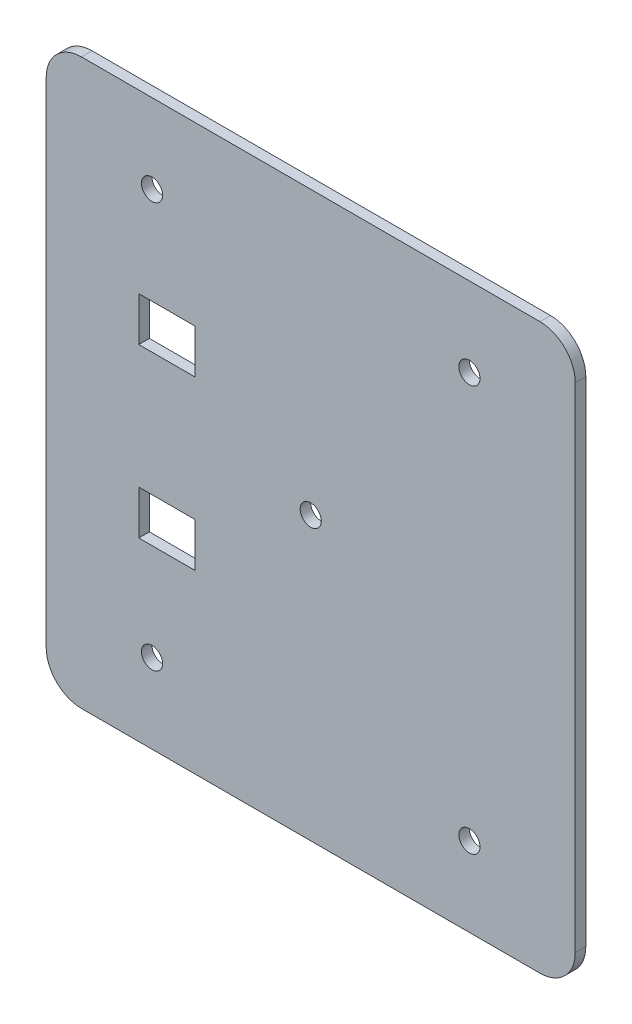
ISO-10303-21;
HEADER;
FILE_DESCRIPTION(('STEP AP214'),'2;1');
FILE_NAME('part.step','',(''),(''),'','','');
FILE_SCHEMA(('AUTOMOTIVE_DESIGN { 1 0 10303 214 1 1 1 1 }'));
ENDSEC;
DATA;
#1=APPLICATION_CONTEXT('core data for automotive mechanical design processes');
#2=APPLICATION_PROTOCOL_DEFINITION('international standard','automotive_design',2000,#1);
#3=PRODUCT_CONTEXT('',#1,'mechanical');
#4=PRODUCT('Part','Part','',(#3));
#5=PRODUCT_RELATED_PRODUCT_CATEGORY('part','',(#4));
#6=PRODUCT_DEFINITION_FORMATION('','',#4);
#7=PRODUCT_DEFINITION_CONTEXT('part definition',#1,'design');
#8=PRODUCT_DEFINITION('design','',#6,#7);
#9=PRODUCT_DEFINITION_SHAPE('','',#8);
#10=(LENGTH_UNIT() NAMED_UNIT(*) SI_UNIT(.MILLI.,.METRE.));
#11=(NAMED_UNIT(*) PLANE_ANGLE_UNIT() SI_UNIT($,.RADIAN.));
#12=(NAMED_UNIT(*) SI_UNIT($,.STERADIAN.) SOLID_ANGLE_UNIT());
#13=UNCERTAINTY_MEASURE_WITH_UNIT(LENGTH_MEASURE(1.E-05),#10,'distance_accuracy_value','');
#14=(GEOMETRIC_REPRESENTATION_CONTEXT(3) GLOBAL_UNCERTAINTY_ASSIGNED_CONTEXT((#13)) GLOBAL_UNIT_ASSIGNED_CONTEXT((#10,
#11,#12)) REPRESENTATION_CONTEXT('',''));
#15=CARTESIAN_POINT('',(0.,0.,0.));
#16=DIRECTION('',(0.,0.,1.));
#17=DIRECTION('',(1.,0.,0.));
#18=AXIS2_PLACEMENT_3D('',#15,#16,#17);
#19=CARTESIAN_POINT('',(0.,22.5,6.));
#20=DIRECTION('',(0.,-1.,0.));
#21=DIRECTION('',(0.,0.,-1.));
#22=AXIS2_PLACEMENT_3D('',#19,#20,#21);
#23=PLANE('',#22);
#24=DIRECTION('',(-1.,0.,0.));
#25=VECTOR('',#24,1.);
#26=CARTESIAN_POINT('',(0.,22.5,0.));
#27=LINE('',#26,#25);
#28=CARTESIAN_POINT('',(9.50000000000003,22.5,0.));
#29=VERTEX_POINT('',#28);
#30=CARTESIAN_POINT('',(-22.5,22.5,0.));
#31=VERTEX_POINT('',#30);
#32=EDGE_CURVE('E236',#29,#31,#27,.T.);
#33=ORIENTED_EDGE('',*,*,#32,.F.);
#34=DIRECTION('',(0.,0.,-1.));
#35=VECTOR('',#34,1.);
#36=CARTESIAN_POINT('',(9.50000000000003,22.5,6.));
#37=LINE('',#36,#35);
#38=CARTESIAN_POINT('',(9.50000000000003,22.5,6.));
#39=VERTEX_POINT('',#38);
#40=EDGE_CURVE('E11',#39,#29,#37,.T.);
#41=ORIENTED_EDGE('',*,*,#40,.F.);
#42=DIRECTION('',(-1.,0.,0.));
#43=VECTOR('',#42,1.);
#44=CARTESIAN_POINT('',(0.,22.5,6.));
#45=LINE('',#44,#43);
#46=CARTESIAN_POINT('',(-22.5,22.5,6.));
#47=VERTEX_POINT('',#46);
#48=EDGE_CURVE('E170',#39,#47,#45,.T.);
#49=ORIENTED_EDGE('',*,*,#48,.T.);
#50=DIRECTION('',(0.,0.,-1.));
#51=VECTOR('',#50,1.);
#52=CARTESIAN_POINT('',(-22.5,22.5,6.));
#53=LINE('',#52,#51);
#54=EDGE_CURVE('E60',#47,#31,#53,.T.);
#55=ORIENTED_EDGE('',*,*,#54,.T.);
#56=EDGE_LOOP('',(#33,#41,#49,#55));
#57=FACE_BOUND('',#56,.T.);
#58=ADVANCED_FACE('F41',(#57),#23,.T.);
#59=CARTESIAN_POINT('',(9.50000000000003,0.,6.));
#60=DIRECTION('',(1.,0.,0.));
#61=DIRECTION('',(0.,1.,0.));
#62=AXIS2_PLACEMENT_3D('',#59,#60,#61);
#63=PLANE('',#62);
#64=DIRECTION('',(0.,-1.,0.));
#65=VECTOR('',#64,1.);
#66=CARTESIAN_POINT('',(9.50000000000003,0.,0.));
#67=LINE('',#66,#65);
#68=CARTESIAN_POINT('',(9.50000000000003,-2.50000000000001,0.));
#69=VERTEX_POINT('',#68);
#70=EDGE_CURVE('E176',#29,#69,#67,.T.);
#71=ORIENTED_EDGE('',*,*,#70,.T.);
#72=DIRECTION('',(0.,0.,-1.));
#73=VECTOR('',#72,1.);
#74=CARTESIAN_POINT('',(9.50000000000003,-2.50000000000001,6.));
#75=LINE('',#74,#73);
#76=CARTESIAN_POINT('',(9.50000000000003,-2.50000000000001,6.));
#77=VERTEX_POINT('',#76);
#78=EDGE_CURVE('E51',#77,#69,#75,.T.);
#79=ORIENTED_EDGE('',*,*,#78,.F.);
#80=DIRECTION('',(0.,-1.,0.));
#81=VECTOR('',#80,1.);
#82=CARTESIAN_POINT('',(9.50000000000003,0.,6.));
#83=LINE('',#82,#81);
#84=EDGE_CURVE('E163',#39,#77,#83,.T.);
#85=ORIENTED_EDGE('',*,*,#84,.F.);
#86=ORIENTED_EDGE('',*,*,#40,.T.);
#87=EDGE_LOOP('',(#71,#79,#85,#86));
#88=FACE_BOUND('',#87,.T.);
#89=ADVANCED_FACE('F174',(#88),#63,.F.);
#90=CARTESIAN_POINT('',(0.,-2.5,6.));
#91=DIRECTION('',(0.,1.,0.));
#92=DIRECTION('',(-1.,0.,0.));
#93=AXIS2_PLACEMENT_3D('',#90,#91,#92);
#94=PLANE('',#93);
#95=DIRECTION('',(1.,0.,0.));
#96=VECTOR('',#95,1.);
#97=CARTESIAN_POINT('',(0.,-2.5,0.));
#98=LINE('',#97,#96);
#99=CARTESIAN_POINT('',(-22.5,-2.5,0.));
#100=VERTEX_POINT('',#99);
#101=EDGE_CURVE('E239',#100,#69,#98,.T.);
#102=ORIENTED_EDGE('',*,*,#101,.F.);
#103=DIRECTION('',(0.,0.,-1.));
#104=VECTOR('',#103,1.);
#105=CARTESIAN_POINT('',(-22.5,-2.5,6.));
#106=LINE('',#105,#104);
#107=CARTESIAN_POINT('',(-22.5,-2.5,6.));
#108=VERTEX_POINT('',#107);
#109=EDGE_CURVE('E109',#108,#100,#106,.T.);
#110=ORIENTED_EDGE('',*,*,#109,.F.);
#111=DIRECTION('',(1.,0.,0.));
#112=VECTOR('',#111,1.);
#113=CARTESIAN_POINT('',(0.,-2.5,6.));
#114=LINE('',#113,#112);
#115=EDGE_CURVE('E169',#108,#77,#114,.T.);
#116=ORIENTED_EDGE('',*,*,#115,.T.);
#117=ORIENTED_EDGE('',*,*,#78,.T.);
#118=EDGE_LOOP('',(#102,#110,#116,#117));
#119=FACE_BOUND('',#118,.T.);
#120=ADVANCED_FACE('F180',(#119),#94,.T.);
#121=CARTESIAN_POINT('',(-22.5,0.,6.));
#122=DIRECTION('',(1.,0.,0.));
#123=DIRECTION('',(0.,1.,0.));
#124=AXIS2_PLACEMENT_3D('',#121,#122,#123);
#125=PLANE('',#124);
#126=DIRECTION('',(0.,-1.,0.));
#127=VECTOR('',#126,1.);
#128=CARTESIAN_POINT('',(-22.5,0.,0.));
#129=LINE('',#128,#127);
#130=CARTESIAN_POINT('',(-22.5,117.5,0.));
#131=VERTEX_POINT('',#130);
#132=CARTESIAN_POINT('',(-22.5,92.5,0.));
#133=VERTEX_POINT('',#132);
#134=EDGE_CURVE('E224',#131,#133,#129,.T.);
#135=ORIENTED_EDGE('',*,*,#134,.F.);
#136=DIRECTION('',(0.,0.,-1.));
#137=VECTOR('',#136,1.);
#138=CARTESIAN_POINT('',(-22.5,117.5,6.));
#139=LINE('',#138,#137);
#140=CARTESIAN_POINT('',(-22.5,117.5,6.));
#141=VERTEX_POINT('',#140);
#142=EDGE_CURVE('E258',#141,#131,#139,.T.);
#143=ORIENTED_EDGE('',*,*,#142,.F.);
#144=DIRECTION('',(0.,-1.,0.));
#145=VECTOR('',#144,1.);
#146=CARTESIAN_POINT('',(-22.5,0.,6.));
#147=LINE('',#146,#145);
#148=CARTESIAN_POINT('',(-22.5,92.5,6.));
#149=VERTEX_POINT('',#148);
#150=EDGE_CURVE('E323',#141,#149,#147,.T.);
#151=ORIENTED_EDGE('',*,*,#150,.T.);
#152=DIRECTION('',(0.,0.,-1.));
#153=VECTOR('',#152,1.);
#154=CARTESIAN_POINT('',(-22.5,92.5,6.));
#155=LINE('',#154,#153);
#156=EDGE_CURVE('E260',#149,#133,#155,.T.);
#157=ORIENTED_EDGE('',*,*,#156,.T.);
#158=EDGE_LOOP('',(#135,#143,#151,#157));
#159=FACE_BOUND('',#158,.T.);
#160=ADVANCED_FACE('F363',(#159),#125,.T.);
#161=CARTESIAN_POINT('',(0.,117.5,6.));
#162=DIRECTION('',(0.,1.,0.));
#163=DIRECTION('',(0.,0.,1.));
#164=AXIS2_PLACEMENT_3D('',#161,#162,#163);
#165=PLANE('',#164);
#166=DIRECTION('',(1.,0.,0.));
#167=VECTOR('',#166,1.);
#168=CARTESIAN_POINT('',(0.,117.5,0.));
#169=LINE('',#168,#167);
#170=CARTESIAN_POINT('',(9.50000000000002,117.5,0.));
#171=VERTEX_POINT('',#170);
#172=EDGE_CURVE('E227',#131,#171,#169,.T.);
#173=ORIENTED_EDGE('',*,*,#172,.T.);
#174=DIRECTION('',(0.,0.,-1.));
#175=VECTOR('',#174,1.);
#176=CARTESIAN_POINT('',(9.50000000000002,117.5,6.));
#177=LINE('',#176,#175);
#178=CARTESIAN_POINT('',(9.50000000000002,117.5,6.));
#179=VERTEX_POINT('',#178);
#180=EDGE_CURVE('E264',#179,#171,#177,.T.);
#181=ORIENTED_EDGE('',*,*,#180,.F.);
#182=DIRECTION('',(1.,0.,0.));
#183=VECTOR('',#182,1.);
#184=CARTESIAN_POINT('',(0.,117.5,6.));
#185=LINE('',#184,#183);
#186=EDGE_CURVE('E326',#141,#179,#185,.T.);
#187=ORIENTED_EDGE('',*,*,#186,.F.);
#188=ORIENTED_EDGE('',*,*,#142,.T.);
#189=EDGE_LOOP('',(#173,#181,#187,#188));
#190=FACE_BOUND('',#189,.T.);
#191=ADVANCED_FACE('F359',(#190),#165,.F.);
#192=CARTESIAN_POINT('',(9.50000000000004,0.,6.));
#193=DIRECTION('',(-1.,0.,0.));
#194=DIRECTION('',(0.,-1.,0.));
#195=AXIS2_PLACEMENT_3D('',#192,#193,#194);
#196=PLANE('',#195);
#197=DIRECTION('',(0.,1.,0.));
#198=VECTOR('',#197,1.);
#199=CARTESIAN_POINT('',(9.50000000000004,0.,0.));
#200=LINE('',#199,#198);
#201=CARTESIAN_POINT('',(9.50000000000002,92.5,0.));
#202=VERTEX_POINT('',#201);
#203=EDGE_CURVE('E230',#202,#171,#200,.T.);
#204=ORIENTED_EDGE('',*,*,#203,.F.);
#205=DIRECTION('',(0.,0.,-1.));
#206=VECTOR('',#205,1.);
#207=CARTESIAN_POINT('',(9.50000000000002,92.5,6.));
#208=LINE('',#207,#206);
#209=CARTESIAN_POINT('',(9.50000000000002,92.5,6.));
#210=VERTEX_POINT('',#209);
#211=EDGE_CURVE('E262',#210,#202,#208,.T.);
#212=ORIENTED_EDGE('',*,*,#211,.F.);
#213=DIRECTION('',(0.,1.,0.));
#214=VECTOR('',#213,1.);
#215=CARTESIAN_POINT('',(9.50000000000004,0.,6.));
#216=LINE('',#215,#214);
#217=EDGE_CURVE('E328',#210,#179,#216,.T.);
#218=ORIENTED_EDGE('',*,*,#217,.T.);
#219=ORIENTED_EDGE('',*,*,#180,.T.);
#220=EDGE_LOOP('',(#204,#212,#218,#219));
#221=FACE_BOUND('',#220,.T.);
#222=ADVANCED_FACE('F356',(#221),#196,.T.);
#223=CARTESIAN_POINT('',(0.,-102.5,6.));
#224=DIRECTION('',(0.,1.,0.));
#225=DIRECTION('',(0.,0.,1.));
#226=AXIS2_PLACEMENT_3D('',#223,#224,#225);
#227=PLANE('',#226);
#228=DIRECTION('',(1.,0.,0.));
#229=VECTOR('',#228,1.);
#230=CARTESIAN_POINT('',(0.,-102.5,0.));
#231=LINE('',#230,#229);
#232=CARTESIAN_POINT('',(-54.9999999999998,-102.5,0.));
#233=VERTEX_POINT('',#232);
#234=CARTESIAN_POINT('',(205.,-102.5,0.));
#235=VERTEX_POINT('',#234);
#236=EDGE_CURVE('E199',#233,#235,#231,.T.);
#237=ORIENTED_EDGE('',*,*,#236,.T.);
#238=DIRECTION('',(0.,0.,-1.));
#239=VECTOR('',#238,1.);
#240=CARTESIAN_POINT('',(205.,-102.5,6.));
#241=LINE('',#240,#239);
#242=CARTESIAN_POINT('',(205.,-102.5,6.));
#243=VERTEX_POINT('',#242);
#244=EDGE_CURVE('E45',#243,#235,#241,.T.);
#245=ORIENTED_EDGE('',*,*,#244,.F.);
#246=DIRECTION('',(1.,0.,0.));
#247=VECTOR('',#246,1.);
#248=CARTESIAN_POINT('',(0.,-102.5,6.));
#249=LINE('',#248,#247);
#250=CARTESIAN_POINT('',(-54.9999999999998,-102.5,6.));
#251=VERTEX_POINT('',#250);
#252=EDGE_CURVE('E256',#251,#243,#249,.T.);
#253=ORIENTED_EDGE('',*,*,#252,.F.);
#254=DIRECTION('',(0.,0.,-1.));
#255=VECTOR('',#254,1.);
#256=CARTESIAN_POINT('',(-54.9999999999998,-102.5,6.));
#257=LINE('',#256,#255);
#258=EDGE_CURVE('E198',#251,#233,#257,.T.);
#259=ORIENTED_EDGE('',*,*,#258,.T.);
#260=EDGE_LOOP('',(#237,#245,#253,#259));
#261=FACE_BOUND('',#260,.T.);
#262=ADVANCED_FACE('F43',(#261),#227,.F.);
#263=CARTESIAN_POINT('',(205.,-82.5,6.));
#264=DIRECTION('',(0.,0.,-1.));
#265=DIRECTION('',(-1.,0.,0.));
#266=AXIS2_PLACEMENT_3D('',#263,#264,#265);
#267=CYLINDRICAL_SURFACE('',#266,20.);
#268=CARTESIAN_POINT('',(205.,-82.5,0.));
#269=DIRECTION('',(0.,0.,1.));
#270=DIRECTION('',(1.,0.,0.));
#271=AXIS2_PLACEMENT_3D('',#268,#269,#270);
#272=CIRCLE('',#271,20.);
#273=CARTESIAN_POINT('',(225.,-82.4999999999998,0.));
#274=VERTEX_POINT('',#273);
#275=EDGE_CURVE('E202',#235,#274,#272,.T.);
#276=ORIENTED_EDGE('',*,*,#275,.T.);
#277=DIRECTION('',(0.,0.,-1.));
#278=VECTOR('',#277,1.);
#279=CARTESIAN_POINT('',(225.,-82.4999999999998,6.));
#280=LINE('',#279,#278);
#281=CARTESIAN_POINT('',(225.,-82.4999999999998,6.));
#282=VERTEX_POINT('',#281);
#283=EDGE_CURVE('E278',#282,#274,#280,.T.);
#284=ORIENTED_EDGE('',*,*,#283,.F.);
#285=CARTESIAN_POINT('',(205.,-82.5,6.));
#286=DIRECTION('',(0.,0.,1.));
#287=DIRECTION('',(1.,0.,0.));
#288=AXIS2_PLACEMENT_3D('',#285,#286,#287);
#289=CIRCLE('',#288,20.);
#290=EDGE_CURVE('E122',#243,#282,#289,.T.);
#291=ORIENTED_EDGE('',*,*,#290,.F.);
#292=ORIENTED_EDGE('',*,*,#244,.T.);
#293=EDGE_LOOP('',(#276,#284,#291,#292));
#294=FACE_BOUND('',#293,.T.);
#295=ADVANCED_FACE('F284',(#294),#267,.T.);
#296=CARTESIAN_POINT('',(225.,0.,6.));
#297=DIRECTION('',(-1.,0.,0.));
#298=DIRECTION('',(0.,0.,1.));
#299=AXIS2_PLACEMENT_3D('',#296,#297,#298);
#300=PLANE('',#299);
#301=DIRECTION('',(0.,1.,0.));
#302=VECTOR('',#301,1.);
#303=CARTESIAN_POINT('',(225.,0.,0.));
#304=LINE('',#303,#302);
#305=CARTESIAN_POINT('',(225.,197.5,0.));
#306=VERTEX_POINT('',#305);
#307=EDGE_CURVE('E204',#274,#306,#304,.T.);
#308=ORIENTED_EDGE('',*,*,#307,.T.);
#309=DIRECTION('',(0.,0.,-1.));
#310=VECTOR('',#309,1.);
#311=CARTESIAN_POINT('',(225.,197.5,6.));
#312=LINE('',#311,#310);
#313=CARTESIAN_POINT('',(225.,197.5,6.));
#314=VERTEX_POINT('',#313);
#315=EDGE_CURVE('E277',#314,#306,#312,.T.);
#316=ORIENTED_EDGE('',*,*,#315,.F.);
#317=DIRECTION('',(0.,1.,0.));
#318=VECTOR('',#317,1.);
#319=CARTESIAN_POINT('',(225.,0.,6.));
#320=LINE('',#319,#318);
#321=EDGE_CURVE('E298',#282,#314,#320,.T.);
#322=ORIENTED_EDGE('',*,*,#321,.F.);
#323=ORIENTED_EDGE('',*,*,#283,.T.);
#324=EDGE_LOOP('',(#308,#316,#322,#323));
#325=FACE_BOUND('',#324,.T.);
#326=ADVANCED_FACE('F296',(#325),#300,.F.);
#327=CARTESIAN_POINT('',(205.,197.5,6.));
#328=DIRECTION('',(0.,0.,-1.));
#329=DIRECTION('',(-1.,0.,0.));
#330=AXIS2_PLACEMENT_3D('',#327,#328,#329);
#331=CYLINDRICAL_SURFACE('',#330,20.);
#332=CARTESIAN_POINT('',(205.,197.5,0.));
#333=DIRECTION('',(0.,0.,1.));
#334=DIRECTION('',(1.,0.,0.));
#335=AXIS2_PLACEMENT_3D('',#332,#333,#334);
#336=CIRCLE('',#335,20.);
#337=CARTESIAN_POINT('',(205.,217.5,0.));
#338=VERTEX_POINT('',#337);
#339=EDGE_CURVE('E207',#338,#306,#336,.F.);
#340=ORIENTED_EDGE('',*,*,#339,.F.);
#341=DIRECTION('',(0.,0.,-1.));
#342=VECTOR('',#341,1.);
#343=CARTESIAN_POINT('',(205.,217.5,6.));
#344=LINE('',#343,#342);
#345=CARTESIAN_POINT('',(205.,217.5,6.));
#346=VERTEX_POINT('',#345);
#347=EDGE_CURVE('E275',#346,#338,#344,.T.);
#348=ORIENTED_EDGE('',*,*,#347,.F.);
#349=CARTESIAN_POINT('',(205.,197.5,6.));
#350=DIRECTION('',(0.,0.,1.));
#351=DIRECTION('',(1.,0.,0.));
#352=AXIS2_PLACEMENT_3D('',#349,#350,#351);
#353=CIRCLE('',#352,20.);
#354=EDGE_CURVE('E301',#346,#314,#353,.F.);
#355=ORIENTED_EDGE('',*,*,#354,.T.);
#356=ORIENTED_EDGE('',*,*,#315,.T.);
#357=EDGE_LOOP('',(#340,#348,#355,#356));
#358=FACE_BOUND('',#357,.T.);
#359=ADVANCED_FACE('F302',(#358),#331,.T.);
#360=CARTESIAN_POINT('',(0.,217.5,6.));
#361=DIRECTION('',(0.,1.,0.));
#362=DIRECTION('',(-1.,0.,0.));
#363=AXIS2_PLACEMENT_3D('',#360,#361,#362);
#364=PLANE('',#363);
#365=DIRECTION('',(1.,0.,0.));
#366=VECTOR('',#365,1.);
#367=CARTESIAN_POINT('',(0.,217.5,0.));
#368=LINE('',#367,#366);
#369=CARTESIAN_POINT('',(-54.9999999999999,217.5,0.));
#370=VERTEX_POINT('',#369);
#371=EDGE_CURVE('E210',#370,#338,#368,.T.);
#372=ORIENTED_EDGE('',*,*,#371,.F.);
#373=DIRECTION('',(0.,0.,-1.));
#374=VECTOR('',#373,1.);
#375=CARTESIAN_POINT('',(-54.9999999999999,217.5,6.));
#376=LINE('',#375,#374);
#377=CARTESIAN_POINT('',(-54.9999999999999,217.5,6.));
#378=VERTEX_POINT('',#377);
#379=EDGE_CURVE('E273',#378,#370,#376,.T.);
#380=ORIENTED_EDGE('',*,*,#379,.F.);
#381=DIRECTION('',(1.,0.,0.));
#382=VECTOR('',#381,1.);
#383=CARTESIAN_POINT('',(0.,217.5,6.));
#384=LINE('',#383,#382);
#385=EDGE_CURVE('E306',#378,#346,#384,.T.);
#386=ORIENTED_EDGE('',*,*,#385,.T.);
#387=ORIENTED_EDGE('',*,*,#347,.T.);
#388=EDGE_LOOP('',(#372,#380,#386,#387));
#389=FACE_BOUND('',#388,.T.);
#390=ADVANCED_FACE('F384',(#389),#364,.T.);
#391=CARTESIAN_POINT('',(-55.,197.5,6.));
#392=DIRECTION('',(0.,0.,-1.));
#393=DIRECTION('',(-1.,0.,0.));
#394=AXIS2_PLACEMENT_3D('',#391,#392,#393);
#395=CYLINDRICAL_SURFACE('',#394,20.);
#396=CARTESIAN_POINT('',(-55.,197.5,0.));
#397=DIRECTION('',(0.,0.,1.));
#398=DIRECTION('',(1.,0.,0.));
#399=AXIS2_PLACEMENT_3D('',#396,#397,#398);
#400=CIRCLE('',#399,20.);
#401=CARTESIAN_POINT('',(-75.,197.5,0.));
#402=VERTEX_POINT('',#401);
#403=EDGE_CURVE('E213',#402,#370,#400,.F.);
#404=ORIENTED_EDGE('',*,*,#403,.F.);
#405=DIRECTION('',(0.,0.,-1.));
#406=VECTOR('',#405,1.);
#407=CARTESIAN_POINT('',(-75.,197.5,6.));
#408=LINE('',#407,#406);
#409=CARTESIAN_POINT('',(-75.,197.5,6.));
#410=VERTEX_POINT('',#409);
#411=EDGE_CURVE('E271',#410,#402,#408,.T.);
#412=ORIENTED_EDGE('',*,*,#411,.F.);
#413=CARTESIAN_POINT('',(-55.,197.5,6.));
#414=DIRECTION('',(0.,0.,1.));
#415=DIRECTION('',(1.,0.,0.));
#416=AXIS2_PLACEMENT_3D('',#413,#414,#415);
#417=CIRCLE('',#416,20.);
#418=EDGE_CURVE('E308',#410,#378,#417,.F.);
#419=ORIENTED_EDGE('',*,*,#418,.T.);
#420=ORIENTED_EDGE('',*,*,#379,.T.);
#421=EDGE_LOOP('',(#404,#412,#419,#420));
#422=FACE_BOUND('',#421,.T.);
#423=ADVANCED_FACE('F380',(#422),#395,.T.);
#424=CARTESIAN_POINT('',(-74.9999999999999,0.,6.));
#425=DIRECTION('',(-1.,0.,0.));
#426=DIRECTION('',(0.,-1.,0.));
#427=AXIS2_PLACEMENT_3D('',#424,#425,#426);
#428=PLANE('',#427);
#429=DIRECTION('',(0.,1.,0.));
#430=VECTOR('',#429,1.);
#431=CARTESIAN_POINT('',(-74.9999999999999,0.,0.));
#432=LINE('',#431,#430);
#433=CARTESIAN_POINT('',(-74.9999999999999,-82.5,0.));
#434=VERTEX_POINT('',#433);
#435=EDGE_CURVE('E216',#434,#402,#432,.T.);
#436=ORIENTED_EDGE('',*,*,#435,.F.);
#437=DIRECTION('',(0.,0.,-1.));
#438=VECTOR('',#437,1.);
#439=CARTESIAN_POINT('',(-74.9999999999999,-82.5,6.));
#440=LINE('',#439,#438);
#441=CARTESIAN_POINT('',(-74.9999999999999,-82.5,6.));
#442=VERTEX_POINT('',#441);
#443=EDGE_CURVE('E269',#442,#434,#440,.T.);
#444=ORIENTED_EDGE('',*,*,#443,.F.);
#445=DIRECTION('',(0.,1.,0.));
#446=VECTOR('',#445,1.);
#447=CARTESIAN_POINT('',(-74.9999999999999,0.,6.));
#448=LINE('',#447,#446);
#449=EDGE_CURVE('E315',#442,#410,#448,.T.);
#450=ORIENTED_EDGE('',*,*,#449,.T.);
#451=ORIENTED_EDGE('',*,*,#411,.T.);
#452=EDGE_LOOP('',(#436,#444,#450,#451));
#453=FACE_BOUND('',#452,.T.);
#454=ADVANCED_FACE('F376',(#453),#428,.T.);
#455=CARTESIAN_POINT('',(-15.,-57.4999999999999,6.));
#456=DIRECTION('',(0.,0.,-1.));
#457=DIRECTION('',(-1.,0.,0.));
#458=AXIS2_PLACEMENT_3D('',#455,#456,#457);
#459=CYLINDRICAL_SURFACE('',#458,6.);
#460=CARTESIAN_POINT('',(-15.,-57.4999999999999,6.));
#461=DIRECTION('',(0.,0.,1.));
#462=DIRECTION('',(1.,0.,0.));
#463=AXIS2_PLACEMENT_3D('',#460,#461,#462);
#464=CIRCLE('',#463,6.);
#465=CARTESIAN_POINT('',(-9.00000000000001,-57.4999999999999,6.));
#466=VERTEX_POINT('',#465);
#467=EDGE_CURVE('E192',#466,#466,#464,.T.);
#468=ORIENTED_EDGE('',*,*,#467,.T.);
#469=EDGE_LOOP('',(#468));
#470=FACE_BOUND('',#469,.T.);
#471=CARTESIAN_POINT('',(-15.,-57.4999999999999,0.));
#472=DIRECTION('',(0.,0.,1.));
#473=DIRECTION('',(1.,0.,0.));
#474=AXIS2_PLACEMENT_3D('',#471,#472,#473);
#475=CIRCLE('',#474,6.);
#476=CARTESIAN_POINT('',(-9.00000000000001,-57.4999999999999,0.));
#477=VERTEX_POINT('',#476);
#478=EDGE_CURVE('E250',#477,#477,#475,.T.);
#479=ORIENTED_EDGE('',*,*,#478,.F.);
#480=EDGE_LOOP('',(#479));
#481=FACE_BOUND('',#480,.T.);
#482=ADVANCED_FACE('F379',(#470,#481),#459,.F.);
#483=CARTESIAN_POINT('',(75.,57.5,6.));
#484=DIRECTION('',(0.,0.,-1.));
#485=DIRECTION('',(-1.,0.,0.));
#486=AXIS2_PLACEMENT_3D('',#483,#484,#485);
#487=CYLINDRICAL_SURFACE('',#486,5.99999999999999);
#488=CARTESIAN_POINT('',(75.,57.5,6.));
#489=DIRECTION('',(0.,0.,1.));
#490=DIRECTION('',(1.,0.,0.));
#491=AXIS2_PLACEMENT_3D('',#488,#489,#490);
#492=CIRCLE('',#491,5.99999999999999);
#493=CARTESIAN_POINT('',(81.,57.5,6.));
#494=VERTEX_POINT('',#493);
#495=EDGE_CURVE('E189',#494,#494,#492,.T.);
#496=ORIENTED_EDGE('',*,*,#495,.T.);
#497=EDGE_LOOP('',(#496));
#498=FACE_BOUND('',#497,.T.);
#499=CARTESIAN_POINT('',(75.,57.5,0.));
#500=DIRECTION('',(0.,0.,1.));
#501=DIRECTION('',(1.,0.,0.));
#502=AXIS2_PLACEMENT_3D('',#499,#500,#501);
#503=CIRCLE('',#502,5.99999999999999);
#504=CARTESIAN_POINT('',(81.,57.5,0.));
#505=VERTEX_POINT('',#504);
#506=EDGE_CURVE('E247',#505,#505,#503,.T.);
#507=ORIENTED_EDGE('',*,*,#506,.F.);
#508=EDGE_LOOP('',(#507));
#509=FACE_BOUND('',#508,.T.);
#510=ADVANCED_FACE('F345',(#498,#509),#487,.F.);
#511=CARTESIAN_POINT('',(165.,172.5,6.));
#512=DIRECTION('',(0.,0.,-1.));
#513=DIRECTION('',(-1.,0.,0.));
#514=AXIS2_PLACEMENT_3D('',#511,#512,#513);
#515=CYLINDRICAL_SURFACE('',#514,6.00000000000002);
#516=CARTESIAN_POINT('',(165.,172.5,6.));
#517=DIRECTION('',(0.,0.,1.));
#518=DIRECTION('',(1.,0.,0.));
#519=AXIS2_PLACEMENT_3D('',#516,#517,#518);
#520=CIRCLE('',#519,6.00000000000002);
#521=CARTESIAN_POINT('',(171.,172.5,6.));
#522=VERTEX_POINT('',#521);
#523=EDGE_CURVE('E183',#522,#522,#520,.T.);
#524=ORIENTED_EDGE('',*,*,#523,.T.);
#525=EDGE_LOOP('',(#524));
#526=FACE_BOUND('',#525,.T.);
#527=CARTESIAN_POINT('',(165.,172.5,0.));
#528=DIRECTION('',(0.,0.,1.));
#529=DIRECTION('',(1.,0.,0.));
#530=AXIS2_PLACEMENT_3D('',#527,#528,#529);
#531=CIRCLE('',#530,6.00000000000002);
#532=CARTESIAN_POINT('',(171.,172.5,0.));
#533=VERTEX_POINT('',#532);
#534=EDGE_CURVE('E244',#533,#533,#531,.T.);
#535=ORIENTED_EDGE('',*,*,#534,.F.);
#536=EDGE_LOOP('',(#535));
#537=FACE_BOUND('',#536,.T.);
#538=ADVANCED_FACE('F336',(#526,#537),#515,.F.);
#539=CARTESIAN_POINT('',(-22.5,0.,6.));
#540=DIRECTION('',(1.,0.,0.));
#541=DIRECTION('',(0.,1.,0.));
#542=AXIS2_PLACEMENT_3D('',#539,#540,#541);
#543=PLANE('',#542);
#544=DIRECTION('',(0.,-1.,0.));
#545=VECTOR('',#544,1.);
#546=CARTESIAN_POINT('',(-22.5,0.,0.));
#547=LINE('',#546,#545);
#548=EDGE_CURVE('E241',#31,#100,#547,.T.);
#549=ORIENTED_EDGE('',*,*,#548,.F.);
#550=ORIENTED_EDGE('',*,*,#54,.F.);
#551=DIRECTION('',(0.,-1.,0.));
#552=VECTOR('',#551,1.);
#553=CARTESIAN_POINT('',(-22.5,0.,6.));
#554=LINE('',#553,#552);
#555=EDGE_CURVE('E181',#47,#108,#554,.T.);
#556=ORIENTED_EDGE('',*,*,#555,.T.);
#557=ORIENTED_EDGE('',*,*,#109,.T.);
#558=EDGE_LOOP('',(#549,#550,#556,#557));
#559=FACE_BOUND('',#558,.T.);
#560=ADVANCED_FACE('F333',(#559),#543,.T.);
#561=CARTESIAN_POINT('',(0.,92.5,6.));
#562=DIRECTION('',(0.,1.,0.));
#563=DIRECTION('',(0.,0.,1.));
#564=AXIS2_PLACEMENT_3D('',#561,#562,#563);
#565=PLANE('',#564);
#566=DIRECTION('',(1.,0.,0.));
#567=VECTOR('',#566,1.);
#568=CARTESIAN_POINT('',(0.,92.5,0.));
#569=LINE('',#568,#567);
#570=EDGE_CURVE('E233',#133,#202,#569,.T.);
#571=ORIENTED_EDGE('',*,*,#570,.F.);
#572=ORIENTED_EDGE('',*,*,#156,.F.);
#573=DIRECTION('',(1.,0.,0.));
#574=VECTOR('',#573,1.);
#575=CARTESIAN_POINT('',(0.,92.5,6.));
#576=LINE('',#575,#574);
#577=EDGE_CURVE('E331',#149,#210,#576,.T.);
#578=ORIENTED_EDGE('',*,*,#577,.T.);
#579=ORIENTED_EDGE('',*,*,#211,.T.);
#580=EDGE_LOOP('',(#571,#572,#578,#579));
#581=FACE_BOUND('',#580,.T.);
#582=ADVANCED_FACE('F335',(#581),#565,.T.);
#583=CARTESIAN_POINT('',(165.,-57.4999999999999,6.));
#584=DIRECTION('',(0.,0.,-1.));
#585=DIRECTION('',(-1.,0.,0.));
#586=AXIS2_PLACEMENT_3D('',#583,#584,#585);
#587=CYLINDRICAL_SURFACE('',#586,6.00000000000002);
#588=CARTESIAN_POINT('',(165.,-57.4999999999999,6.));
#589=DIRECTION('',(0.,0.,1.));
#590=DIRECTION('',(1.,0.,0.));
#591=AXIS2_PLACEMENT_3D('',#588,#589,#590);
#592=CIRCLE('',#591,6.00000000000002);
#593=CARTESIAN_POINT('',(171.,-57.4999999999999,6.));
#594=VERTEX_POINT('',#593);
#595=EDGE_CURVE('E320',#594,#594,#592,.T.);
#596=ORIENTED_EDGE('',*,*,#595,.T.);
#597=EDGE_LOOP('',(#596));
#598=FACE_BOUND('',#597,.T.);
#599=CARTESIAN_POINT('',(165.,-57.4999999999999,0.));
#600=DIRECTION('',(0.,0.,1.));
#601=DIRECTION('',(1.,0.,0.));
#602=AXIS2_PLACEMENT_3D('',#599,#600,#601);
#603=CIRCLE('',#602,6.00000000000002);
#604=CARTESIAN_POINT('',(171.,-57.4999999999999,0.));
#605=VERTEX_POINT('',#604);
#606=EDGE_CURVE('E221',#605,#605,#603,.T.);
#607=ORIENTED_EDGE('',*,*,#606,.F.);
#608=EDGE_LOOP('',(#607));
#609=FACE_BOUND('',#608,.T.);
#610=ADVANCED_FACE('F342',(#598,#609),#587,.F.);
#611=CARTESIAN_POINT('',(-55.,-82.5,6.));
#612=DIRECTION('',(0.,0.,-1.));
#613=DIRECTION('',(-1.,0.,0.));
#614=AXIS2_PLACEMENT_3D('',#611,#612,#613);
#615=CYLINDRICAL_SURFACE('',#614,20.);
#616=CARTESIAN_POINT('',(-55.,-82.5,0.));
#617=DIRECTION('',(0.,0.,1.));
#618=DIRECTION('',(1.,0.,0.));
#619=AXIS2_PLACEMENT_3D('',#616,#617,#618);
#620=CIRCLE('',#619,20.);
#621=EDGE_CURVE('E219',#434,#233,#620,.T.);
#622=ORIENTED_EDGE('',*,*,#621,.T.);
#623=ORIENTED_EDGE('',*,*,#258,.F.);
#624=CARTESIAN_POINT('',(-55.,-82.5,6.));
#625=DIRECTION('',(0.,0.,1.));
#626=DIRECTION('',(1.,0.,0.));
#627=AXIS2_PLACEMENT_3D('',#624,#625,#626);
#628=CIRCLE('',#627,20.);
#629=EDGE_CURVE('E318',#442,#251,#628,.T.);
#630=ORIENTED_EDGE('',*,*,#629,.F.);
#631=ORIENTED_EDGE('',*,*,#443,.T.);
#632=EDGE_LOOP('',(#622,#623,#630,#631));
#633=FACE_BOUND('',#632,.T.);
#634=ADVANCED_FACE('F370',(#633),#615,.T.);
#635=CARTESIAN_POINT('',(-15.,172.5,6.));
#636=DIRECTION('',(0.,0.,-1.));
#637=DIRECTION('',(-1.,0.,0.));
#638=AXIS2_PLACEMENT_3D('',#635,#636,#637);
#639=CYLINDRICAL_SURFACE('',#638,5.99999999999999);
#640=CARTESIAN_POINT('',(-15.,172.5,6.));
#641=DIRECTION('',(0.,0.,1.));
#642=DIRECTION('',(1.,0.,0.));
#643=AXIS2_PLACEMENT_3D('',#640,#641,#642);
#644=CIRCLE('',#643,5.99999999999999);
#645=CARTESIAN_POINT('',(-9.00000000000001,172.5,6.));
#646=VERTEX_POINT('',#645);
#647=EDGE_CURVE('E195',#646,#646,#644,.T.);
#648=ORIENTED_EDGE('',*,*,#647,.T.);
#649=EDGE_LOOP('',(#648));
#650=FACE_BOUND('',#649,.T.);
#651=CARTESIAN_POINT('',(-15.,172.5,0.));
#652=DIRECTION('',(0.,0.,1.));
#653=DIRECTION('',(1.,0.,0.));
#654=AXIS2_PLACEMENT_3D('',#651,#652,#653);
#655=CIRCLE('',#654,5.99999999999999);
#656=CARTESIAN_POINT('',(-9.00000000000001,172.5,0.));
#657=VERTEX_POINT('',#656);
#658=EDGE_CURVE('E253',#657,#657,#655,.T.);
#659=ORIENTED_EDGE('',*,*,#658,.F.);
#660=EDGE_LOOP('',(#659));
#661=FACE_BOUND('',#660,.T.);
#662=ADVANCED_FACE('F374',(#650,#661),#639,.F.);
#663=CARTESIAN_POINT('',(0.,0.,6.));
#664=DIRECTION('',(0.,0.,1.));
#665=DIRECTION('',(1.,0.,0.));
#666=AXIS2_PLACEMENT_3D('',#663,#664,#665);
#667=PLANE('',#666);
#668=ORIENTED_EDGE('',*,*,#252,.T.);
#669=ORIENTED_EDGE('',*,*,#290,.T.);
#670=ORIENTED_EDGE('',*,*,#321,.T.);
#671=ORIENTED_EDGE('',*,*,#354,.F.);
#672=ORIENTED_EDGE('',*,*,#385,.F.);
#673=ORIENTED_EDGE('',*,*,#418,.F.);
#674=ORIENTED_EDGE('',*,*,#449,.F.);
#675=ORIENTED_EDGE('',*,*,#629,.T.);
#676=EDGE_LOOP('',(#668,#669,#670,#671,#672,#673,#674,#675));
#677=FACE_BOUND('',#676,.T.);
#678=ORIENTED_EDGE('',*,*,#595,.F.);
#679=EDGE_LOOP('',(#678));
#680=FACE_BOUND('',#679,.T.);
#681=ORIENTED_EDGE('',*,*,#150,.F.);
#682=ORIENTED_EDGE('',*,*,#186,.T.);
#683=ORIENTED_EDGE('',*,*,#217,.F.);
#684=ORIENTED_EDGE('',*,*,#577,.F.);
#685=EDGE_LOOP('',(#681,#682,#683,#684));
#686=FACE_BOUND('',#685,.T.);
#687=ORIENTED_EDGE('',*,*,#48,.F.);
#688=ORIENTED_EDGE('',*,*,#84,.T.);
#689=ORIENTED_EDGE('',*,*,#115,.F.);
#690=ORIENTED_EDGE('',*,*,#555,.F.);
#691=EDGE_LOOP('',(#687,#688,#689,#690));
#692=FACE_BOUND('',#691,.T.);
#693=ORIENTED_EDGE('',*,*,#523,.F.);
#694=EDGE_LOOP('',(#693));
#695=FACE_BOUND('',#694,.T.);
#696=ORIENTED_EDGE('',*,*,#495,.F.);
#697=EDGE_LOOP('',(#696));
#698=FACE_BOUND('',#697,.T.);
#699=ORIENTED_EDGE('',*,*,#467,.F.);
#700=EDGE_LOOP('',(#699));
#701=FACE_BOUND('',#700,.T.);
#702=ORIENTED_EDGE('',*,*,#647,.F.);
#703=EDGE_LOOP('',(#702));
#704=FACE_BOUND('',#703,.T.);
#705=ADVANCED_FACE('F165',(#677,#680,#686,#692,#695,#698,#701,#704),#667,.T.);
#706=CARTESIAN_POINT('',(0.,0.,0.));
#707=DIRECTION('',(0.,0.,1.));
#708=DIRECTION('',(1.,0.,0.));
#709=AXIS2_PLACEMENT_3D('',#706,#707,#708);
#710=PLANE('',#709);
#711=ORIENTED_EDGE('',*,*,#236,.F.);
#712=ORIENTED_EDGE('',*,*,#621,.F.);
#713=ORIENTED_EDGE('',*,*,#435,.T.);
#714=ORIENTED_EDGE('',*,*,#403,.T.);
#715=ORIENTED_EDGE('',*,*,#371,.T.);
#716=ORIENTED_EDGE('',*,*,#339,.T.);
#717=ORIENTED_EDGE('',*,*,#307,.F.);
#718=ORIENTED_EDGE('',*,*,#275,.F.);
#719=EDGE_LOOP('',(#711,#712,#713,#714,#715,#716,#717,#718));
#720=FACE_BOUND('',#719,.T.);
#721=ORIENTED_EDGE('',*,*,#606,.T.);
#722=EDGE_LOOP('',(#721));
#723=FACE_BOUND('',#722,.T.);
#724=ORIENTED_EDGE('',*,*,#134,.T.);
#725=ORIENTED_EDGE('',*,*,#570,.T.);
#726=ORIENTED_EDGE('',*,*,#203,.T.);
#727=ORIENTED_EDGE('',*,*,#172,.F.);
#728=EDGE_LOOP('',(#724,#725,#726,#727));
#729=FACE_BOUND('',#728,.T.);
#730=ORIENTED_EDGE('',*,*,#32,.T.);
#731=ORIENTED_EDGE('',*,*,#548,.T.);
#732=ORIENTED_EDGE('',*,*,#101,.T.);
#733=ORIENTED_EDGE('',*,*,#70,.F.);
#734=EDGE_LOOP('',(#730,#731,#732,#733));
#735=FACE_BOUND('',#734,.T.);
#736=ORIENTED_EDGE('',*,*,#534,.T.);
#737=EDGE_LOOP('',(#736));
#738=FACE_BOUND('',#737,.T.);
#739=ORIENTED_EDGE('',*,*,#506,.T.);
#740=EDGE_LOOP('',(#739));
#741=FACE_BOUND('',#740,.T.);
#742=ORIENTED_EDGE('',*,*,#478,.T.);
#743=EDGE_LOOP('',(#742));
#744=FACE_BOUND('',#743,.T.);
#745=ORIENTED_EDGE('',*,*,#658,.T.);
#746=EDGE_LOOP('',(#745));
#747=FACE_BOUND('',#746,.T.);
#748=ADVANCED_FACE('F291',(#720,#723,#729,#735,#738,#741,#744,#747),#710,.F.);
#749=CLOSED_SHELL('',(#58,#89,#120,#160,#191,#222,#262,#295,#326,#359,#390,#423,#454,#482,#510,
#538,#560,#582,#610,#634,#662,#705,#748));
#750=MANIFOLD_SOLID_BREP('B2',#749);
#751=ADVANCED_BREP_SHAPE_REPRESENTATION('',(#18,#750),#14);
#752=SHAPE_DEFINITION_REPRESENTATION(#9,#751);
ENDSEC;
END-ISO-10303-21;
